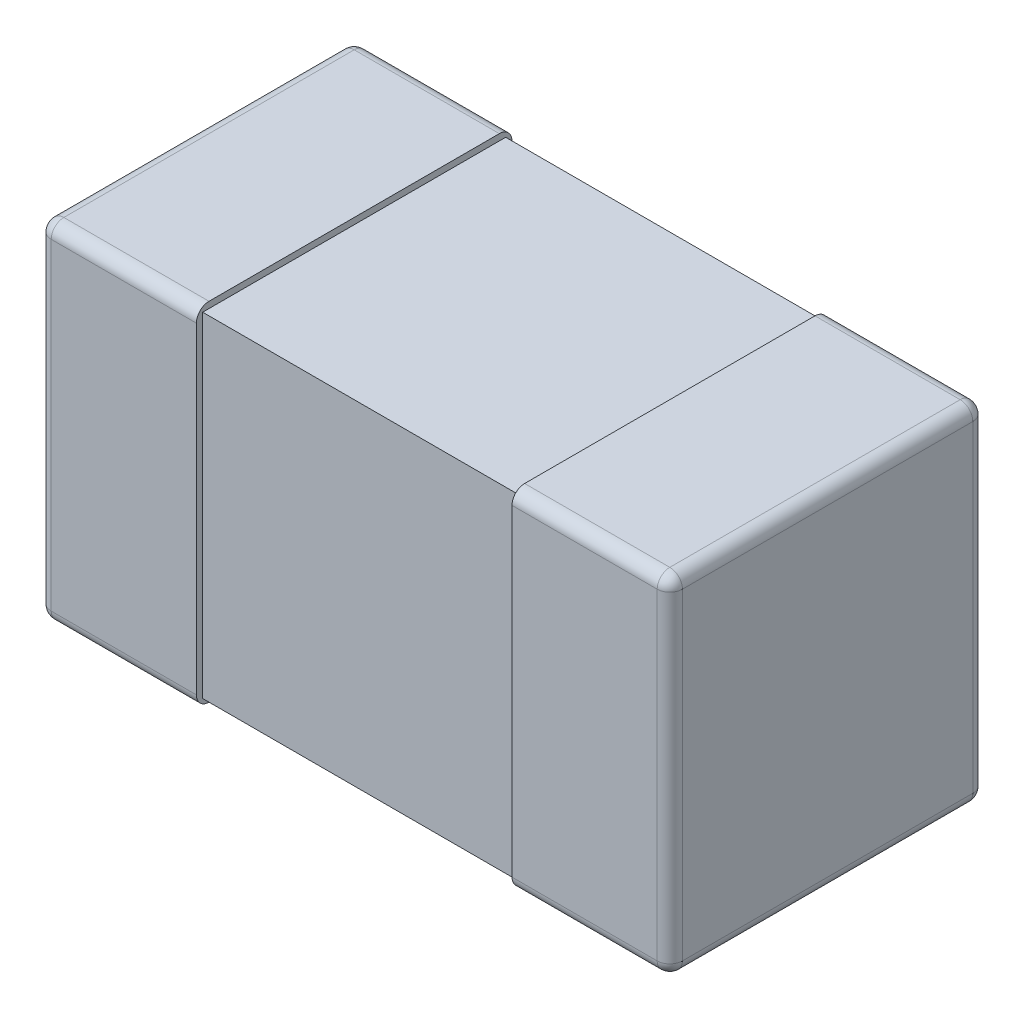
ISO-10303-21;
HEADER;
FILE_DESCRIPTION(('STEP AP214'),'2;1');
FILE_NAME('part.step','',(''),(''),'','','');
FILE_SCHEMA(('AUTOMOTIVE_DESIGN { 1 0 10303 214 1 1 1 1 }'));
ENDSEC;
DATA;
#1=APPLICATION_CONTEXT('core data for automotive mechanical design processes');
#2=APPLICATION_PROTOCOL_DEFINITION('international standard','automotive_design',2000,#1);
#3=PRODUCT_CONTEXT('',#1,'mechanical');
#4=PRODUCT('Part','Part','',(#3));
#5=PRODUCT_RELATED_PRODUCT_CATEGORY('part','',(#4));
#6=PRODUCT_DEFINITION_FORMATION('','',#4);
#7=PRODUCT_DEFINITION_CONTEXT('part definition',#1,'design');
#8=PRODUCT_DEFINITION('design','',#6,#7);
#9=PRODUCT_DEFINITION_SHAPE('','',#8);
#10=(LENGTH_UNIT() NAMED_UNIT(*) SI_UNIT(.MILLI.,.METRE.));
#11=(NAMED_UNIT(*) PLANE_ANGLE_UNIT() SI_UNIT($,.RADIAN.));
#12=(NAMED_UNIT(*) SI_UNIT($,.STERADIAN.) SOLID_ANGLE_UNIT());
#13=UNCERTAINTY_MEASURE_WITH_UNIT(LENGTH_MEASURE(1.E-05),#10,'distance_accuracy_value','');
#14=(GEOMETRIC_REPRESENTATION_CONTEXT(3) GLOBAL_UNCERTAINTY_ASSIGNED_CONTEXT((#13)) GLOBAL_UNIT_ASSIGNED_CONTEXT((#10,
#11,#12)) REPRESENTATION_CONTEXT('',''));
#15=CARTESIAN_POINT('',(0.,0.,0.));
#16=DIRECTION('',(0.,0.,1.));
#17=DIRECTION('',(1.,0.,0.));
#18=AXIS2_PLACEMENT_3D('',#15,#16,#17);
#19=CARTESIAN_POINT('',(0.5,0.55,0.25));
#20=DIRECTION('',(-1.,0.,0.));
#21=DIRECTION('',(0.,0.,1.));
#22=AXIS2_PLACEMENT_3D('',#19,#20,#21);
#23=PLANE('',#22);
#24=DIRECTION('',(0.,1.,0.));
#25=VECTOR('',#24,1.);
#26=CARTESIAN_POINT('',(0.5,0.55,-0.23));
#27=LINE('',#26,#25);
#28=CARTESIAN_POINT('',(0.5,0.53,-0.23));
#29=VERTEX_POINT('',#28);
#30=CARTESIAN_POINT('',(0.5,0.02,-0.23));
#31=VERTEX_POINT('',#30);
#32=EDGE_CURVE('E690',#29,#31,#27,.F.);
#33=ORIENTED_EDGE('',*,*,#32,.F.);
#34=DIRECTION('',(0.,0.,1.));
#35=VECTOR('',#34,1.);
#36=CARTESIAN_POINT('',(0.5,0.53,0.));
#37=LINE('',#36,#35);
#38=CARTESIAN_POINT('',(0.5,0.53,0.23));
#39=VERTEX_POINT('',#38);
#40=EDGE_CURVE('E415',#39,#29,#37,.F.);
#41=ORIENTED_EDGE('',*,*,#40,.F.);
#42=DIRECTION('',(0.,-1.,0.));
#43=VECTOR('',#42,1.);
#44=CARTESIAN_POINT('',(0.5,0.55,0.23));
#45=LINE('',#44,#43);
#46=CARTESIAN_POINT('',(0.5,0.02,0.23));
#47=VERTEX_POINT('',#46);
#48=EDGE_CURVE('E698',#47,#39,#45,.F.);
#49=ORIENTED_EDGE('',*,*,#48,.F.);
#50=DIRECTION('',(0.,0.,-1.));
#51=VECTOR('',#50,1.);
#52=CARTESIAN_POINT('',(0.5,0.02,0.25));
#53=LINE('',#52,#51);
#54=EDGE_CURVE('E465',#31,#47,#53,.F.);
#55=ORIENTED_EDGE('',*,*,#54,.F.);
#56=EDGE_LOOP('',(#33,#41,#49,#55));
#57=FACE_BOUND('',#56,.T.);
#58=ADVANCED_FACE('F17',(#57),#23,.F.);
#59=CARTESIAN_POINT('',(-0.5,0.55,0.));
#60=DIRECTION('',(-1.,0.,0.));
#61=DIRECTION('',(0.,0.,1.));
#62=AXIS2_PLACEMENT_3D('',#59,#60,#61);
#63=PLANE('',#62);
#64=DIRECTION('',(0.,0.,-1.));
#65=VECTOR('',#64,1.);
#66=CARTESIAN_POINT('',(-0.5,0.53,0.));
#67=LINE('',#66,#65);
#68=CARTESIAN_POINT('',(-0.5,0.53,-0.23));
#69=VERTEX_POINT('',#68);
#70=CARTESIAN_POINT('',(-0.5,0.53,0.23));
#71=VERTEX_POINT('',#70);
#72=EDGE_CURVE('E409',#69,#71,#67,.F.);
#73=ORIENTED_EDGE('',*,*,#72,.F.);
#74=DIRECTION('',(0.,1.,0.));
#75=VECTOR('',#74,1.);
#76=CARTESIAN_POINT('',(-0.5,0.55,-0.23));
#77=LINE('',#76,#75);
#78=CARTESIAN_POINT('',(-0.5,0.02,-0.23));
#79=VERTEX_POINT('',#78);
#80=EDGE_CURVE('E357',#79,#69,#77,.T.);
#81=ORIENTED_EDGE('',*,*,#80,.F.);
#82=DIRECTION('',(0.,0.,1.));
#83=VECTOR('',#82,1.);
#84=CARTESIAN_POINT('',(-0.5,0.02,0.));
#85=LINE('',#84,#83);
#86=CARTESIAN_POINT('',(-0.5,0.02,0.23));
#87=VERTEX_POINT('',#86);
#88=EDGE_CURVE('E672',#87,#79,#85,.F.);
#89=ORIENTED_EDGE('',*,*,#88,.F.);
#90=DIRECTION('',(0.,-1.,0.));
#91=VECTOR('',#90,1.);
#92=CARTESIAN_POINT('',(-0.5,0.55,0.23));
#93=LINE('',#92,#91);
#94=EDGE_CURVE('E314',#71,#87,#93,.T.);
#95=ORIENTED_EDGE('',*,*,#94,.F.);
#96=EDGE_LOOP('',(#73,#81,#89,#95));
#97=FACE_BOUND('',#96,.T.);
#98=ADVANCED_FACE('F490',(#97),#63,.T.);
#99=CARTESIAN_POINT('',(0.48,0.55,-0.23));
#100=DIRECTION('',(0.,1.,0.));
#101=DIRECTION('',(0.,0.,1.));
#102=AXIS2_PLACEMENT_3D('',#99,#100,#101);
#103=CYLINDRICAL_SURFACE('',#102,0.02);
#104=CARTESIAN_POINT('',(0.48,0.02,-0.23));
#105=DIRECTION('',(0.,1.,0.));
#106=DIRECTION('',(1.,0.,0.));
#107=AXIS2_PLACEMENT_3D('',#104,#105,#106);
#108=CIRCLE('',#107,0.02);
#109=CARTESIAN_POINT('',(0.48,0.02,-0.25));
#110=VERTEX_POINT('',#109);
#111=EDGE_CURVE('E478',#110,#31,#108,.F.);
#112=ORIENTED_EDGE('',*,*,#111,.F.);
#113=DIRECTION('',(0.,1.,0.));
#114=VECTOR('',#113,1.);
#115=CARTESIAN_POINT('',(0.48,0.55,-0.25));
#116=LINE('',#115,#114);
#117=CARTESIAN_POINT('',(0.48,0.53,-0.25));
#118=VERTEX_POINT('',#117);
#119=EDGE_CURVE('E296',#118,#110,#116,.F.);
#120=ORIENTED_EDGE('',*,*,#119,.F.);
#121=CARTESIAN_POINT('',(0.48,0.53,-0.23));
#122=DIRECTION('',(0.,1.,0.));
#123=DIRECTION('',(1.,0.,0.));
#124=AXIS2_PLACEMENT_3D('',#121,#122,#123);
#125=CIRCLE('',#124,0.02);
#126=EDGE_CURVE('E406',#29,#118,#125,.T.);
#127=ORIENTED_EDGE('',*,*,#126,.F.);
#128=ORIENTED_EDGE('',*,*,#32,.T.);
#129=EDGE_LOOP('',(#112,#120,#127,#128));
#130=FACE_BOUND('',#129,.T.);
#131=ADVANCED_FACE('F487',(#130),#103,.T.);
#132=CARTESIAN_POINT('',(0.48,0.02,-0.23));
#133=DIRECTION('',(1.,0.,0.));
#134=DIRECTION('',(0.,0.,-1.));
#135=AXIS2_PLACEMENT_3D('',#132,#133,#134);
#136=SPHERICAL_SURFACE('',#135,0.02);
#137=CARTESIAN_POINT('',(0.48,0.02,-0.23));
#138=DIRECTION('',(0.,0.,-1.));
#139=DIRECTION('',(-1.,0.,0.));
#140=AXIS2_PLACEMENT_3D('',#137,#138,#139);
#141=CIRCLE('',#140,0.02);
#142=CARTESIAN_POINT('',(0.48,0.,-0.23));
#143=VERTEX_POINT('',#142);
#144=EDGE_CURVE('E475',#143,#31,#141,.F.);
#145=ORIENTED_EDGE('',*,*,#144,.F.);
#146=CARTESIAN_POINT('',(0.48,0.02,-0.23));
#147=DIRECTION('',(-1.,0.,0.));
#148=DIRECTION('',(0.,0.,1.));
#149=AXIS2_PLACEMENT_3D('',#146,#147,#148);
#150=CIRCLE('',#149,0.02);
#151=EDGE_CURVE('E187',#110,#143,#150,.T.);
#152=ORIENTED_EDGE('',*,*,#151,.F.);
#153=ORIENTED_EDGE('',*,*,#111,.T.);
#154=EDGE_LOOP('',(#145,#152,#153));
#155=FACE_BOUND('',#154,.T.);
#156=ADVANCED_FACE('F484',(#155),#136,.T.);
#157=CARTESIAN_POINT('',(0.48,0.02,0.25));
#158=DIRECTION('',(0.,0.,-1.));
#159=DIRECTION('',(-1.,0.,0.));
#160=AXIS2_PLACEMENT_3D('',#157,#158,#159);
#161=CYLINDRICAL_SURFACE('',#160,0.02);
#162=ORIENTED_EDGE('',*,*,#144,.T.);
#163=ORIENTED_EDGE('',*,*,#54,.T.);
#164=CARTESIAN_POINT('',(0.48,0.02,0.23));
#165=DIRECTION('',(0.,0.,-1.));
#166=DIRECTION('',(1.,0.,0.));
#167=AXIS2_PLACEMENT_3D('',#164,#165,#166);
#168=CIRCLE('',#167,0.02);
#169=CARTESIAN_POINT('',(0.48,0.,0.23));
#170=VERTEX_POINT('',#169);
#171=EDGE_CURVE('E461',#170,#47,#168,.F.);
#172=ORIENTED_EDGE('',*,*,#171,.F.);
#173=DIRECTION('',(0.,0.,1.));
#174=VECTOR('',#173,1.);
#175=CARTESIAN_POINT('',(0.48,0.,0.));
#176=LINE('',#175,#174);
#177=EDGE_CURVE('E191',#170,#143,#176,.F.);
#178=ORIENTED_EDGE('',*,*,#177,.T.);
#179=EDGE_LOOP('',(#162,#163,#172,#178));
#180=FACE_BOUND('',#179,.T.);
#181=ADVANCED_FACE('F453',(#180),#161,.T.);
#182=CARTESIAN_POINT('',(0.48,0.02,0.23));
#183=DIRECTION('',(1.,0.,0.));
#184=DIRECTION('',(0.,0.,-1.));
#185=AXIS2_PLACEMENT_3D('',#182,#183,#184);
#186=SPHERICAL_SURFACE('',#185,0.02);
#187=CARTESIAN_POINT('',(0.48,0.02,0.23));
#188=DIRECTION('',(1.,0.,0.));
#189=DIRECTION('',(0.,0.,-1.));
#190=AXIS2_PLACEMENT_3D('',#187,#188,#189);
#191=CIRCLE('',#190,0.02);
#192=CARTESIAN_POINT('',(0.48,0.0200000000000001,0.25));
#193=VERTEX_POINT('',#192);
#194=EDGE_CURVE('E290',#170,#193,#191,.F.);
#195=ORIENTED_EDGE('',*,*,#194,.F.);
#196=ORIENTED_EDGE('',*,*,#171,.T.);
#197=CARTESIAN_POINT('',(0.48,0.0200000000000001,0.23));
#198=DIRECTION('',(0.,-1.,0.));
#199=DIRECTION('',(0.,0.,-1.));
#200=AXIS2_PLACEMENT_3D('',#197,#198,#199);
#201=CIRCLE('',#200,0.02);
#202=EDGE_CURVE('E464',#193,#47,#201,.F.);
#203=ORIENTED_EDGE('',*,*,#202,.F.);
#204=EDGE_LOOP('',(#195,#196,#203));
#205=FACE_BOUND('',#204,.T.);
#206=ADVANCED_FACE('F448',(#205),#186,.T.);
#207=CARTESIAN_POINT('',(0.48,0.55,0.23));
#208=DIRECTION('',(0.,-1.,0.));
#209=DIRECTION('',(0.,0.,-1.));
#210=AXIS2_PLACEMENT_3D('',#207,#208,#209);
#211=CYLINDRICAL_SURFACE('',#210,0.02);
#212=ORIENTED_EDGE('',*,*,#202,.T.);
#213=ORIENTED_EDGE('',*,*,#48,.T.);
#214=CARTESIAN_POINT('',(0.48,0.53,0.23));
#215=DIRECTION('',(0.,-1.,0.));
#216=DIRECTION('',(1.,0.,0.));
#217=AXIS2_PLACEMENT_3D('',#214,#215,#216);
#218=CIRCLE('',#217,0.02);
#219=CARTESIAN_POINT('',(0.48,0.53,0.25));
#220=VERTEX_POINT('',#219);
#221=EDGE_CURVE('E429',#220,#39,#218,.F.);
#222=ORIENTED_EDGE('',*,*,#221,.F.);
#223=DIRECTION('',(0.,1.,0.));
#224=VECTOR('',#223,1.);
#225=CARTESIAN_POINT('',(0.48,0.55,0.25));
#226=LINE('',#225,#224);
#227=EDGE_CURVE('E286',#220,#193,#226,.F.);
#228=ORIENTED_EDGE('',*,*,#227,.T.);
#229=EDGE_LOOP('',(#212,#213,#222,#228));
#230=FACE_BOUND('',#229,.T.);
#231=ADVANCED_FACE('F444',(#230),#211,.T.);
#232=CARTESIAN_POINT('',(0.48,0.53,0.23));
#233=DIRECTION('',(1.,0.,0.));
#234=DIRECTION('',(0.,0.,-1.));
#235=AXIS2_PLACEMENT_3D('',#232,#233,#234);
#236=SPHERICAL_SURFACE('',#235,0.02);
#237=CARTESIAN_POINT('',(0.48,0.53,0.23));
#238=DIRECTION('',(-1.,0.,0.));
#239=DIRECTION('',(0.,0.,1.));
#240=AXIS2_PLACEMENT_3D('',#237,#238,#239);
#241=CIRCLE('',#240,0.02);
#242=CARTESIAN_POINT('',(0.48,0.55,0.23));
#243=VERTEX_POINT('',#242);
#244=EDGE_CURVE('E281',#220,#243,#241,.T.);
#245=ORIENTED_EDGE('',*,*,#244,.F.);
#246=ORIENTED_EDGE('',*,*,#221,.T.);
#247=CARTESIAN_POINT('',(0.48,0.53,0.23));
#248=DIRECTION('',(0.,0.,1.));
#249=DIRECTION('',(1.,0.,0.));
#250=AXIS2_PLACEMENT_3D('',#247,#248,#249);
#251=CIRCLE('',#250,0.02);
#252=EDGE_CURVE('E426',#243,#39,#251,.F.);
#253=ORIENTED_EDGE('',*,*,#252,.F.);
#254=EDGE_LOOP('',(#245,#246,#253));
#255=FACE_BOUND('',#254,.T.);
#256=ADVANCED_FACE('F440',(#255),#236,.T.);
#257=CARTESIAN_POINT('',(0.48,0.53,0.));
#258=DIRECTION('',(0.,0.,1.));
#259=DIRECTION('',(1.,0.,0.));
#260=AXIS2_PLACEMENT_3D('',#257,#258,#259);
#261=CYLINDRICAL_SURFACE('',#260,0.02);
#262=CARTESIAN_POINT('',(0.48,0.53,-0.23));
#263=DIRECTION('',(0.,0.,1.));
#264=DIRECTION('',(1.,0.,0.));
#265=AXIS2_PLACEMENT_3D('',#262,#263,#264);
#266=CIRCLE('',#265,0.02);
#267=CARTESIAN_POINT('',(0.48,0.55,-0.23));
#268=VERTEX_POINT('',#267);
#269=EDGE_CURVE('E410',#268,#29,#266,.F.);
#270=ORIENTED_EDGE('',*,*,#269,.F.);
#271=DIRECTION('',(0.,0.,1.));
#272=VECTOR('',#271,1.);
#273=CARTESIAN_POINT('',(0.48,0.55,0.));
#274=LINE('',#273,#272);
#275=EDGE_CURVE('E275',#243,#268,#274,.F.);
#276=ORIENTED_EDGE('',*,*,#275,.F.);
#277=ORIENTED_EDGE('',*,*,#252,.T.);
#278=ORIENTED_EDGE('',*,*,#40,.T.);
#279=EDGE_LOOP('',(#270,#276,#277,#278));
#280=FACE_BOUND('',#279,.T.);
#281=ADVANCED_FACE('F443',(#280),#261,.T.);
#282=CARTESIAN_POINT('',(0.48,0.53,-0.23));
#283=DIRECTION('',(1.,0.,0.));
#284=DIRECTION('',(0.,0.,-1.));
#285=AXIS2_PLACEMENT_3D('',#282,#283,#284);
#286=SPHERICAL_SURFACE('',#285,0.02);
#287=ORIENTED_EDGE('',*,*,#269,.T.);
#288=ORIENTED_EDGE('',*,*,#126,.T.);
#289=CARTESIAN_POINT('',(0.48,0.53,-0.23));
#290=DIRECTION('',(1.,0.,0.));
#291=DIRECTION('',(0.,0.,-1.));
#292=AXIS2_PLACEMENT_3D('',#289,#290,#291);
#293=CIRCLE('',#292,0.02);
#294=EDGE_CURVE('E264',#268,#118,#293,.F.);
#295=ORIENTED_EDGE('',*,*,#294,.F.);
#296=EDGE_LOOP('',(#287,#288,#295));
#297=FACE_BOUND('',#296,.T.);
#298=ADVANCED_FACE('F389',(#297),#286,.T.);
#299=CARTESIAN_POINT('',(-0.48,0.53,0.23));
#300=DIRECTION('',(1.,0.,0.));
#301=DIRECTION('',(0.,0.,-1.));
#302=AXIS2_PLACEMENT_3D('',#299,#300,#301);
#303=SPHERICAL_SURFACE('',#302,0.02);
#304=CARTESIAN_POINT('',(-0.48,0.53,0.23));
#305=DIRECTION('',(0.,0.,-1.));
#306=DIRECTION('',(-1.,0.,0.));
#307=AXIS2_PLACEMENT_3D('',#304,#305,#306);
#308=CIRCLE('',#307,0.02);
#309=CARTESIAN_POINT('',(-0.48,0.55,0.23));
#310=VERTEX_POINT('',#309);
#311=EDGE_CURVE('E687',#71,#310,#308,.T.);
#312=ORIENTED_EDGE('',*,*,#311,.F.);
#313=CARTESIAN_POINT('',(-0.48,0.53,0.23));
#314=DIRECTION('',(0.,-1.,0.));
#315=DIRECTION('',(0.,0.,-1.));
#316=AXIS2_PLACEMENT_3D('',#313,#314,#315);
#317=CIRCLE('',#316,0.02);
#318=CARTESIAN_POINT('',(-0.48,0.53,0.25));
#319=VERTEX_POINT('',#318);
#320=EDGE_CURVE('E311',#319,#71,#317,.T.);
#321=ORIENTED_EDGE('',*,*,#320,.F.);
#322=CARTESIAN_POINT('',(-0.48,0.53,0.23));
#323=DIRECTION('',(-1.,0.,0.));
#324=DIRECTION('',(0.,0.,1.));
#325=AXIS2_PLACEMENT_3D('',#322,#323,#324);
#326=CIRCLE('',#325,0.02);
#327=EDGE_CURVE('E263',#310,#319,#326,.F.);
#328=ORIENTED_EDGE('',*,*,#327,.F.);
#329=EDGE_LOOP('',(#312,#321,#328));
#330=FACE_BOUND('',#329,.T.);
#331=ADVANCED_FACE('F384',(#330),#303,.T.);
#332=CARTESIAN_POINT('',(-0.48,0.53,0.));
#333=DIRECTION('',(0.,0.,-1.));
#334=DIRECTION('',(-1.,0.,0.));
#335=AXIS2_PLACEMENT_3D('',#332,#333,#334);
#336=CYLINDRICAL_SURFACE('',#335,0.02);
#337=ORIENTED_EDGE('',*,*,#311,.T.);
#338=DIRECTION('',(0.,0.,1.));
#339=VECTOR('',#338,1.);
#340=CARTESIAN_POINT('',(-0.48,0.55,0.));
#341=LINE('',#340,#339);
#342=CARTESIAN_POINT('',(-0.48,0.55,-0.23));
#343=VERTEX_POINT('',#342);
#344=EDGE_CURVE('E257',#343,#310,#341,.T.);
#345=ORIENTED_EDGE('',*,*,#344,.F.);
#346=CARTESIAN_POINT('',(-0.48,0.53,-0.23));
#347=DIRECTION('',(0.,0.,1.));
#348=DIRECTION('',(1.,0.,0.));
#349=AXIS2_PLACEMENT_3D('',#346,#347,#348);
#350=CIRCLE('',#349,0.02);
#351=EDGE_CURVE('E363',#69,#343,#350,.F.);
#352=ORIENTED_EDGE('',*,*,#351,.F.);
#353=ORIENTED_EDGE('',*,*,#72,.T.);
#354=EDGE_LOOP('',(#337,#345,#352,#353));
#355=FACE_BOUND('',#354,.T.);
#356=ADVANCED_FACE('F380',(#355),#336,.T.);
#357=CARTESIAN_POINT('',(-0.48,0.53,-0.23));
#358=DIRECTION('',(1.,0.,0.));
#359=DIRECTION('',(0.,0.,-1.));
#360=AXIS2_PLACEMENT_3D('',#357,#358,#359);
#361=SPHERICAL_SURFACE('',#360,0.02);
#362=CARTESIAN_POINT('',(-0.48,0.53,-0.23));
#363=DIRECTION('',(0.,1.,0.));
#364=DIRECTION('',(0.,0.,1.));
#365=AXIS2_PLACEMENT_3D('',#362,#363,#364);
#366=CIRCLE('',#365,0.02);
#367=CARTESIAN_POINT('',(-0.48,0.53,-0.25));
#368=VERTEX_POINT('',#367);
#369=EDGE_CURVE('E360',#69,#368,#366,.F.);
#370=ORIENTED_EDGE('',*,*,#369,.F.);
#371=ORIENTED_EDGE('',*,*,#351,.T.);
#372=CARTESIAN_POINT('',(-0.48,0.53,-0.23));
#373=DIRECTION('',(1.,0.,0.));
#374=DIRECTION('',(0.,0.,-1.));
#375=AXIS2_PLACEMENT_3D('',#372,#373,#374);
#376=CIRCLE('',#375,0.02);
#377=EDGE_CURVE('E251',#368,#343,#376,.T.);
#378=ORIENTED_EDGE('',*,*,#377,.F.);
#379=EDGE_LOOP('',(#370,#371,#378));
#380=FACE_BOUND('',#379,.T.);
#381=ADVANCED_FACE('F377',(#380),#361,.T.);
#382=CARTESIAN_POINT('',(-0.48,0.55,-0.23));
#383=DIRECTION('',(0.,1.,0.));
#384=DIRECTION('',(0.,0.,1.));
#385=AXIS2_PLACEMENT_3D('',#382,#383,#384);
#386=CYLINDRICAL_SURFACE('',#385,0.02);
#387=CARTESIAN_POINT('',(-0.48,0.02,-0.23));
#388=DIRECTION('',(0.,1.,0.));
#389=DIRECTION('',(1.,0.,0.));
#390=AXIS2_PLACEMENT_3D('',#387,#388,#389);
#391=CIRCLE('',#390,0.02);
#392=CARTESIAN_POINT('',(-0.48,0.02,-0.25));
#393=VERTEX_POINT('',#392);
#394=EDGE_CURVE('E353',#79,#393,#391,.F.);
#395=ORIENTED_EDGE('',*,*,#394,.F.);
#396=ORIENTED_EDGE('',*,*,#80,.T.);
#397=ORIENTED_EDGE('',*,*,#369,.T.);
#398=DIRECTION('',(0.,1.,0.));
#399=VECTOR('',#398,1.);
#400=CARTESIAN_POINT('',(-0.48,0.55,-0.25));
#401=LINE('',#400,#399);
#402=EDGE_CURVE('E245',#368,#393,#401,.F.);
#403=ORIENTED_EDGE('',*,*,#402,.T.);
#404=EDGE_LOOP('',(#395,#396,#397,#403));
#405=FACE_BOUND('',#404,.T.);
#406=ADVANCED_FACE('F345',(#405),#386,.T.);
#407=CARTESIAN_POINT('',(-0.48,0.02,-0.23));
#408=DIRECTION('',(1.,0.,0.));
#409=DIRECTION('',(0.,0.,-1.));
#410=AXIS2_PLACEMENT_3D('',#407,#408,#409);
#411=SPHERICAL_SURFACE('',#410,0.02);
#412=CARTESIAN_POINT('',(-0.48,0.02,-0.23));
#413=DIRECTION('',(-1.,0.,0.));
#414=DIRECTION('',(0.,0.,1.));
#415=AXIS2_PLACEMENT_3D('',#412,#413,#414);
#416=CIRCLE('',#415,0.02);
#417=CARTESIAN_POINT('',(-0.48,0.,-0.23));
#418=VERTEX_POINT('',#417);
#419=EDGE_CURVE('E239',#418,#393,#416,.F.);
#420=ORIENTED_EDGE('',*,*,#419,.F.);
#421=CARTESIAN_POINT('',(-0.48,0.02,-0.23));
#422=DIRECTION('',(0.,0.,1.));
#423=DIRECTION('',(1.,0.,0.));
#424=AXIS2_PLACEMENT_3D('',#421,#422,#423);
#425=CIRCLE('',#424,0.02);
#426=EDGE_CURVE('E356',#79,#418,#425,.T.);
#427=ORIENTED_EDGE('',*,*,#426,.F.);
#428=ORIENTED_EDGE('',*,*,#394,.T.);
#429=EDGE_LOOP('',(#420,#427,#428));
#430=FACE_BOUND('',#429,.T.);
#431=ADVANCED_FACE('F340',(#430),#411,.T.);
#432=CARTESIAN_POINT('',(-0.48,0.02,0.));
#433=DIRECTION('',(0.,0.,1.));
#434=DIRECTION('',(1.,0.,0.));
#435=AXIS2_PLACEMENT_3D('',#432,#433,#434);
#436=CYLINDRICAL_SURFACE('',#435,0.02);
#437=CARTESIAN_POINT('',(-0.48,0.02,0.23));
#438=DIRECTION('',(0.,0.,-1.));
#439=DIRECTION('',(1.,0.,0.));
#440=AXIS2_PLACEMENT_3D('',#437,#438,#439);
#441=CIRCLE('',#440,0.02);
#442=CARTESIAN_POINT('',(-0.48,0.,0.23));
#443=VERTEX_POINT('',#442);
#444=EDGE_CURVE('E315',#87,#443,#441,.F.);
#445=ORIENTED_EDGE('',*,*,#444,.F.);
#446=ORIENTED_EDGE('',*,*,#88,.T.);
#447=ORIENTED_EDGE('',*,*,#426,.T.);
#448=DIRECTION('',(0.,0.,1.));
#449=VECTOR('',#448,1.);
#450=CARTESIAN_POINT('',(-0.48,0.,0.));
#451=LINE('',#450,#449);
#452=EDGE_CURVE('E233',#418,#443,#451,.T.);
#453=ORIENTED_EDGE('',*,*,#452,.T.);
#454=EDGE_LOOP('',(#445,#446,#447,#453));
#455=FACE_BOUND('',#454,.T.);
#456=ADVANCED_FACE('F335',(#455),#436,.T.);
#457=CARTESIAN_POINT('',(-0.48,0.02,0.23));
#458=DIRECTION('',(1.,0.,0.));
#459=DIRECTION('',(0.,0.,-1.));
#460=AXIS2_PLACEMENT_3D('',#457,#458,#459);
#461=SPHERICAL_SURFACE('',#460,0.02);
#462=CARTESIAN_POINT('',(-0.48,0.02,0.23));
#463=DIRECTION('',(1.,0.,0.));
#464=DIRECTION('',(0.,0.,-1.));
#465=AXIS2_PLACEMENT_3D('',#462,#463,#464);
#466=CIRCLE('',#465,0.02);
#467=CARTESIAN_POINT('',(-0.48,0.0200000000000001,0.25));
#468=VERTEX_POINT('',#467);
#469=EDGE_CURVE('E227',#468,#443,#466,.T.);
#470=ORIENTED_EDGE('',*,*,#469,.F.);
#471=CARTESIAN_POINT('',(-0.48,0.0200000000000001,0.23));
#472=DIRECTION('',(0.,-1.,0.));
#473=DIRECTION('',(0.,0.,-1.));
#474=AXIS2_PLACEMENT_3D('',#471,#472,#473);
#475=CIRCLE('',#474,0.02);
#476=EDGE_CURVE('E318',#87,#468,#475,.F.);
#477=ORIENTED_EDGE('',*,*,#476,.F.);
#478=ORIENTED_EDGE('',*,*,#444,.T.);
#479=EDGE_LOOP('',(#470,#477,#478));
#480=FACE_BOUND('',#479,.T.);
#481=ADVANCED_FACE('F330',(#480),#461,.T.);
#482=CARTESIAN_POINT('',(-0.48,0.55,0.23));
#483=DIRECTION('',(0.,-1.,0.));
#484=DIRECTION('',(0.,0.,-1.));
#485=AXIS2_PLACEMENT_3D('',#482,#483,#484);
#486=CYLINDRICAL_SURFACE('',#485,0.02);
#487=ORIENTED_EDGE('',*,*,#476,.T.);
#488=DIRECTION('',(0.,1.,0.));
#489=VECTOR('',#488,1.);
#490=CARTESIAN_POINT('',(-0.48,0.55,0.25));
#491=LINE('',#490,#489);
#492=EDGE_CURVE('E217',#319,#468,#491,.F.);
#493=ORIENTED_EDGE('',*,*,#492,.F.);
#494=ORIENTED_EDGE('',*,*,#320,.T.);
#495=ORIENTED_EDGE('',*,*,#94,.T.);
#496=EDGE_LOOP('',(#487,#493,#494,#495));
#497=FACE_BOUND('',#496,.T.);
#498=ADVANCED_FACE('F334',(#497),#486,.T.);
#499=CARTESIAN_POINT('',(0.25,0.55,-0.25));
#500=DIRECTION('',(0.,0.,-1.));
#501=DIRECTION('',(-1.,0.,0.));
#502=AXIS2_PLACEMENT_3D('',#499,#500,#501);
#503=PLANE('',#502);
#504=DIRECTION('',(0.,1.,0.));
#505=VECTOR('',#504,1.);
#506=CARTESIAN_POINT('',(0.25,0.55,-0.25));
#507=LINE('',#506,#505);
#508=CARTESIAN_POINT('',(0.25,0.53,-0.25));
#509=VERTEX_POINT('',#508);
#510=CARTESIAN_POINT('',(0.25,0.02,-0.25));
#511=VERTEX_POINT('',#510);
#512=EDGE_CURVE('E206',#509,#511,#507,.F.);
#513=ORIENTED_EDGE('',*,*,#512,.F.);
#514=DIRECTION('',(1.,0.,0.));
#515=VECTOR('',#514,1.);
#516=CARTESIAN_POINT('',(0.25,0.53,-0.25));
#517=LINE('',#516,#515);
#518=EDGE_CURVE('E260',#118,#509,#517,.F.);
#519=ORIENTED_EDGE('',*,*,#518,.F.);
#520=ORIENTED_EDGE('',*,*,#119,.T.);
#521=DIRECTION('',(-1.,0.,0.));
#522=VECTOR('',#521,1.);
#523=CARTESIAN_POINT('',(0.,0.02,-0.25));
#524=LINE('',#523,#522);
#525=EDGE_CURVE('E175',#511,#110,#524,.F.);
#526=ORIENTED_EDGE('',*,*,#525,.F.);
#527=EDGE_LOOP('',(#513,#519,#520,#526));
#528=FACE_BOUND('',#527,.T.);
#529=ADVANCED_FACE('F580',(#528),#503,.T.);
#530=CARTESIAN_POINT('',(0.,0.02,-0.23));
#531=DIRECTION('',(-1.,0.,0.));
#532=DIRECTION('',(0.,0.,1.));
#533=AXIS2_PLACEMENT_3D('',#530,#531,#532);
#534=CYLINDRICAL_SURFACE('',#533,0.02);
#535=ORIENTED_EDGE('',*,*,#151,.T.);
#536=DIRECTION('',(1.,0.,0.));
#537=VECTOR('',#536,1.);
#538=CARTESIAN_POINT('',(0.,0.,-0.23));
#539=LINE('',#538,#537);
#540=CARTESIAN_POINT('',(0.25,0.,-0.23));
#541=VERTEX_POINT('',#540);
#542=EDGE_CURVE('E181',#143,#541,#539,.F.);
#543=ORIENTED_EDGE('',*,*,#542,.T.);
#544=CARTESIAN_POINT('',(0.25,0.02,-0.23));
#545=DIRECTION('',(-1.,0.,0.));
#546=DIRECTION('',(0.,0.,1.));
#547=AXIS2_PLACEMENT_3D('',#544,#545,#546);
#548=CIRCLE('',#547,0.02);
#549=EDGE_CURVE('E20',#511,#541,#548,.T.);
#550=ORIENTED_EDGE('',*,*,#549,.F.);
#551=ORIENTED_EDGE('',*,*,#525,.T.);
#552=EDGE_LOOP('',(#535,#543,#550,#551));
#553=FACE_BOUND('',#552,.T.);
#554=ADVANCED_FACE('F183',(#553),#534,.T.);
#555=CARTESIAN_POINT('',(0.,0.,0.));
#556=DIRECTION('',(0.,1.,0.));
#557=DIRECTION('',(0.,0.,1.));
#558=AXIS2_PLACEMENT_3D('',#555,#556,#557);
#559=PLANE('',#558);
#560=ORIENTED_EDGE('',*,*,#542,.F.);
#561=ORIENTED_EDGE('',*,*,#177,.F.);
#562=DIRECTION('',(1.,0.,0.));
#563=VECTOR('',#562,1.);
#564=CARTESIAN_POINT('',(0.25,0.,0.23));
#565=LINE('',#564,#563);
#566=CARTESIAN_POINT('',(0.25,0.,0.23));
#567=VERTEX_POINT('',#566);
#568=EDGE_CURVE('E190',#567,#170,#565,.T.);
#569=ORIENTED_EDGE('',*,*,#568,.F.);
#570=DIRECTION('',(0.,0.,1.));
#571=VECTOR('',#570,1.);
#572=CARTESIAN_POINT('',(0.25,0.,0.25));
#573=LINE('',#572,#571);
#574=EDGE_CURVE('E194',#541,#567,#573,.T.);
#575=ORIENTED_EDGE('',*,*,#574,.F.);
#576=EDGE_LOOP('',(#560,#561,#569,#575));
#577=FACE_BOUND('',#576,.T.);
#578=ADVANCED_FACE('F195',(#577),#559,.F.);
#579=CARTESIAN_POINT('',(0.25,0.02,0.23));
#580=DIRECTION('',(1.,0.,0.));
#581=DIRECTION('',(0.,0.,-1.));
#582=AXIS2_PLACEMENT_3D('',#579,#580,#581);
#583=CYLINDRICAL_SURFACE('',#582,0.02);
#584=ORIENTED_EDGE('',*,*,#194,.T.);
#585=DIRECTION('',(-1.,0.,0.));
#586=VECTOR('',#585,1.);
#587=CARTESIAN_POINT('',(0.25,0.0200000000000001,0.25));
#588=LINE('',#587,#586);
#589=CARTESIAN_POINT('',(0.25,0.02,0.25));
#590=VERTEX_POINT('',#589);
#591=EDGE_CURVE('E284',#193,#590,#588,.T.);
#592=ORIENTED_EDGE('',*,*,#591,.T.);
#593=CARTESIAN_POINT('',(0.25,0.02,0.23));
#594=DIRECTION('',(1.,0.,0.));
#595=DIRECTION('',(0.,0.,-1.));
#596=AXIS2_PLACEMENT_3D('',#593,#594,#595);
#597=CIRCLE('',#596,0.02);
#598=EDGE_CURVE('E200',#567,#590,#597,.F.);
#599=ORIENTED_EDGE('',*,*,#598,.F.);
#600=ORIENTED_EDGE('',*,*,#568,.T.);
#601=EDGE_LOOP('',(#584,#592,#599,#600));
#602=FACE_BOUND('',#601,.T.);
#603=ADVANCED_FACE('F572',(#602),#583,.T.);
#604=CARTESIAN_POINT('',(0.25,0.55,0.25));
#605=DIRECTION('',(0.,0.,-1.));
#606=DIRECTION('',(-1.,0.,0.));
#607=AXIS2_PLACEMENT_3D('',#604,#605,#606);
#608=PLANE('',#607);
#609=ORIENTED_EDGE('',*,*,#591,.F.);
#610=ORIENTED_EDGE('',*,*,#227,.F.);
#611=DIRECTION('',(-1.,0.,0.));
#612=VECTOR('',#611,1.);
#613=CARTESIAN_POINT('',(0.,0.53,0.25));
#614=LINE('',#613,#612);
#615=CARTESIAN_POINT('',(0.25,0.53,0.25));
#616=VERTEX_POINT('',#615);
#617=EDGE_CURVE('E278',#616,#220,#614,.F.);
#618=ORIENTED_EDGE('',*,*,#617,.F.);
#619=DIRECTION('',(0.,1.,0.));
#620=VECTOR('',#619,1.);
#621=CARTESIAN_POINT('',(0.25,0.55,0.25));
#622=LINE('',#621,#620);
#623=EDGE_CURVE('E603',#590,#616,#622,.T.);
#624=ORIENTED_EDGE('',*,*,#623,.F.);
#625=EDGE_LOOP('',(#609,#610,#618,#624));
#626=FACE_BOUND('',#625,.T.);
#627=ADVANCED_FACE('F568',(#626),#608,.F.);
#628=CARTESIAN_POINT('',(0.,0.53,0.23));
#629=DIRECTION('',(-1.,0.,0.));
#630=DIRECTION('',(0.,0.,1.));
#631=AXIS2_PLACEMENT_3D('',#628,#629,#630);
#632=CYLINDRICAL_SURFACE('',#631,0.02);
#633=CARTESIAN_POINT('',(0.25,0.53,0.23));
#634=DIRECTION('',(-1.,0.,0.));
#635=DIRECTION('',(0.,0.,1.));
#636=AXIS2_PLACEMENT_3D('',#633,#634,#635);
#637=CIRCLE('',#636,0.02);
#638=CARTESIAN_POINT('',(0.25,0.55,0.23));
#639=VERTEX_POINT('',#638);
#640=EDGE_CURVE('E597',#616,#639,#637,.T.);
#641=ORIENTED_EDGE('',*,*,#640,.F.);
#642=ORIENTED_EDGE('',*,*,#617,.T.);
#643=ORIENTED_EDGE('',*,*,#244,.T.);
#644=DIRECTION('',(1.,0.,0.));
#645=VECTOR('',#644,1.);
#646=CARTESIAN_POINT('',(0.,0.55,0.23));
#647=LINE('',#646,#645);
#648=EDGE_CURVE('E270',#639,#243,#647,.T.);
#649=ORIENTED_EDGE('',*,*,#648,.F.);
#650=EDGE_LOOP('',(#641,#642,#643,#649));
#651=FACE_BOUND('',#650,.T.);
#652=ADVANCED_FACE('F564',(#651),#632,.T.);
#653=CARTESIAN_POINT('',(0.,0.55,0.));
#654=DIRECTION('',(0.,1.,0.));
#655=DIRECTION('',(0.,0.,1.));
#656=AXIS2_PLACEMENT_3D('',#653,#654,#655);
#657=PLANE('',#656);
#658=DIRECTION('',(0.,0.,1.));
#659=VECTOR('',#658,1.);
#660=CARTESIAN_POINT('',(0.25,0.55,0.25));
#661=LINE('',#660,#659);
#662=CARTESIAN_POINT('',(0.25,0.55,-0.23));
#663=VERTEX_POINT('',#662);
#664=EDGE_CURVE('E592',#639,#663,#661,.F.);
#665=ORIENTED_EDGE('',*,*,#664,.F.);
#666=ORIENTED_EDGE('',*,*,#648,.T.);
#667=ORIENTED_EDGE('',*,*,#275,.T.);
#668=DIRECTION('',(1.,0.,0.));
#669=VECTOR('',#668,1.);
#670=CARTESIAN_POINT('',(0.25,0.55,-0.23));
#671=LINE('',#670,#669);
#672=EDGE_CURVE('E267',#663,#268,#671,.T.);
#673=ORIENTED_EDGE('',*,*,#672,.F.);
#674=EDGE_LOOP('',(#665,#666,#667,#673));
#675=FACE_BOUND('',#674,.T.);
#676=ADVANCED_FACE('F560',(#675),#657,.T.);
#677=CARTESIAN_POINT('',(0.25,0.53,-0.23));
#678=DIRECTION('',(1.,0.,0.));
#679=DIRECTION('',(0.,0.,-1.));
#680=AXIS2_PLACEMENT_3D('',#677,#678,#679);
#681=CYLINDRICAL_SURFACE('',#680,0.02);
#682=ORIENTED_EDGE('',*,*,#294,.T.);
#683=ORIENTED_EDGE('',*,*,#518,.T.);
#684=CARTESIAN_POINT('',(0.25,0.53,-0.23));
#685=DIRECTION('',(1.,0.,0.));
#686=DIRECTION('',(0.,0.,-1.));
#687=AXIS2_PLACEMENT_3D('',#684,#685,#686);
#688=CIRCLE('',#687,0.02);
#689=EDGE_CURVE('E588',#663,#509,#688,.F.);
#690=ORIENTED_EDGE('',*,*,#689,.F.);
#691=ORIENTED_EDGE('',*,*,#672,.T.);
#692=EDGE_LOOP('',(#682,#683,#690,#691));
#693=FACE_BOUND('',#692,.T.);
#694=ADVANCED_FACE('F556',(#693),#681,.T.);
#695=CARTESIAN_POINT('',(0.,0.53,0.23));
#696=DIRECTION('',(-1.,0.,0.));
#697=DIRECTION('',(0.,0.,1.));
#698=AXIS2_PLACEMENT_3D('',#695,#696,#697);
#699=CYLINDRICAL_SURFACE('',#698,0.02);
#700=ORIENTED_EDGE('',*,*,#327,.T.);
#701=DIRECTION('',(1.,0.,0.));
#702=VECTOR('',#701,1.);
#703=CARTESIAN_POINT('',(0.,0.53,0.25));
#704=LINE('',#703,#702);
#705=CARTESIAN_POINT('',(-0.25,0.53,0.25));
#706=VERTEX_POINT('',#705);
#707=EDGE_CURVE('E210',#706,#319,#704,.F.);
#708=ORIENTED_EDGE('',*,*,#707,.F.);
#709=CARTESIAN_POINT('',(-0.25,0.53,0.23));
#710=DIRECTION('',(-1.,0.,0.));
#711=DIRECTION('',(0.,0.,1.));
#712=AXIS2_PLACEMENT_3D('',#709,#710,#711);
#713=CIRCLE('',#712,0.02);
#714=CARTESIAN_POINT('',(-0.25,0.55,0.23));
#715=VERTEX_POINT('',#714);
#716=EDGE_CURVE('E601',#706,#715,#713,.T.);
#717=ORIENTED_EDGE('',*,*,#716,.T.);
#718=DIRECTION('',(1.,0.,0.));
#719=VECTOR('',#718,1.);
#720=CARTESIAN_POINT('',(0.,0.55,0.23));
#721=LINE('',#720,#719);
#722=EDGE_CURVE('E254',#310,#715,#721,.T.);
#723=ORIENTED_EDGE('',*,*,#722,.F.);
#724=EDGE_LOOP('',(#700,#708,#717,#723));
#725=FACE_BOUND('',#724,.T.);
#726=ADVANCED_FACE('F552',(#725),#699,.T.);
#727=CARTESIAN_POINT('',(0.,0.55,0.));
#728=DIRECTION('',(0.,1.,0.));
#729=DIRECTION('',(0.,0.,1.));
#730=AXIS2_PLACEMENT_3D('',#727,#728,#729);
#731=PLANE('',#730);
#732=ORIENTED_EDGE('',*,*,#344,.T.);
#733=ORIENTED_EDGE('',*,*,#722,.T.);
#734=DIRECTION('',(0.,0.,1.));
#735=VECTOR('',#734,1.);
#736=CARTESIAN_POINT('',(-0.25,0.55,0.));
#737=LINE('',#736,#735);
#738=CARTESIAN_POINT('',(-0.25,0.55,-0.23));
#739=VERTEX_POINT('',#738);
#740=EDGE_CURVE('E612',#715,#739,#737,.F.);
#741=ORIENTED_EDGE('',*,*,#740,.T.);
#742=DIRECTION('',(1.,0.,0.));
#743=VECTOR('',#742,1.);
#744=CARTESIAN_POINT('',(0.,0.55,-0.23));
#745=LINE('',#744,#743);
#746=EDGE_CURVE('E246',#343,#739,#745,.T.);
#747=ORIENTED_EDGE('',*,*,#746,.F.);
#748=EDGE_LOOP('',(#732,#733,#741,#747));
#749=FACE_BOUND('',#748,.T.);
#750=ADVANCED_FACE('F548',(#749),#731,.T.);
#751=CARTESIAN_POINT('',(0.,0.53,-0.23));
#752=DIRECTION('',(1.,0.,0.));
#753=DIRECTION('',(0.,0.,-1.));
#754=AXIS2_PLACEMENT_3D('',#751,#752,#753);
#755=CYLINDRICAL_SURFACE('',#754,0.02);
#756=ORIENTED_EDGE('',*,*,#377,.T.);
#757=ORIENTED_EDGE('',*,*,#746,.T.);
#758=CARTESIAN_POINT('',(-0.25,0.53,-0.23));
#759=DIRECTION('',(1.,0.,0.));
#760=DIRECTION('',(0.,0.,-1.));
#761=AXIS2_PLACEMENT_3D('',#758,#759,#760);
#762=CIRCLE('',#761,0.02);
#763=CARTESIAN_POINT('',(-0.25,0.53,-0.25));
#764=VERTEX_POINT('',#763);
#765=EDGE_CURVE('E614',#739,#764,#762,.F.);
#766=ORIENTED_EDGE('',*,*,#765,.T.);
#767=DIRECTION('',(1.,0.,0.));
#768=VECTOR('',#767,1.);
#769=CARTESIAN_POINT('',(0.,0.53,-0.25));
#770=LINE('',#769,#768);
#771=EDGE_CURVE('E242',#764,#368,#770,.F.);
#772=ORIENTED_EDGE('',*,*,#771,.T.);
#773=EDGE_LOOP('',(#756,#757,#766,#772));
#774=FACE_BOUND('',#773,.T.);
#775=ADVANCED_FACE('F544',(#774),#755,.T.);
#776=CARTESIAN_POINT('',(0.,0.55,-0.25));
#777=DIRECTION('',(0.,0.,1.));
#778=DIRECTION('',(1.,0.,0.));
#779=AXIS2_PLACEMENT_3D('',#776,#777,#778);
#780=PLANE('',#779);
#781=DIRECTION('',(-1.,0.,0.));
#782=VECTOR('',#781,1.);
#783=CARTESIAN_POINT('',(0.,0.02,-0.25));
#784=LINE('',#783,#782);
#785=CARTESIAN_POINT('',(-0.25,0.02,-0.25));
#786=VERTEX_POINT('',#785);
#787=EDGE_CURVE('E234',#393,#786,#784,.F.);
#788=ORIENTED_EDGE('',*,*,#787,.F.);
#789=ORIENTED_EDGE('',*,*,#402,.F.);
#790=ORIENTED_EDGE('',*,*,#771,.F.);
#791=DIRECTION('',(0.,1.,0.));
#792=VECTOR('',#791,1.);
#793=CARTESIAN_POINT('',(-0.25,0.55,-0.25));
#794=LINE('',#793,#792);
#795=EDGE_CURVE('E615',#764,#786,#794,.F.);
#796=ORIENTED_EDGE('',*,*,#795,.T.);
#797=EDGE_LOOP('',(#788,#789,#790,#796));
#798=FACE_BOUND('',#797,.T.);
#799=ADVANCED_FACE('F540',(#798),#780,.F.);
#800=CARTESIAN_POINT('',(0.,0.02,-0.23));
#801=DIRECTION('',(-1.,0.,0.));
#802=DIRECTION('',(0.,0.,1.));
#803=AXIS2_PLACEMENT_3D('',#800,#801,#802);
#804=CYLINDRICAL_SURFACE('',#803,0.02);
#805=ORIENTED_EDGE('',*,*,#419,.T.);
#806=ORIENTED_EDGE('',*,*,#787,.T.);
#807=CARTESIAN_POINT('',(-0.25,0.02,-0.23));
#808=DIRECTION('',(-1.,0.,0.));
#809=DIRECTION('',(0.,0.,1.));
#810=AXIS2_PLACEMENT_3D('',#807,#808,#809);
#811=CIRCLE('',#810,0.02);
#812=CARTESIAN_POINT('',(-0.25,0.,-0.23));
#813=VERTEX_POINT('',#812);
#814=EDGE_CURVE('E617',#786,#813,#811,.T.);
#815=ORIENTED_EDGE('',*,*,#814,.T.);
#816=DIRECTION('',(1.,0.,0.));
#817=VECTOR('',#816,1.);
#818=CARTESIAN_POINT('',(0.,0.,-0.23));
#819=LINE('',#818,#817);
#820=EDGE_CURVE('E230',#813,#418,#819,.F.);
#821=ORIENTED_EDGE('',*,*,#820,.T.);
#822=EDGE_LOOP('',(#805,#806,#815,#821));
#823=FACE_BOUND('',#822,.T.);
#824=ADVANCED_FACE('F536',(#823),#804,.T.);
#825=CARTESIAN_POINT('',(0.,0.,0.));
#826=DIRECTION('',(0.,1.,0.));
#827=DIRECTION('',(0.,0.,1.));
#828=AXIS2_PLACEMENT_3D('',#825,#826,#827);
#829=PLANE('',#828);
#830=DIRECTION('',(1.,0.,0.));
#831=VECTOR('',#830,1.);
#832=CARTESIAN_POINT('',(0.,0.,0.23));
#833=LINE('',#832,#831);
#834=CARTESIAN_POINT('',(-0.25,0.,0.23));
#835=VERTEX_POINT('',#834);
#836=EDGE_CURVE('E224',#443,#835,#833,.T.);
#837=ORIENTED_EDGE('',*,*,#836,.F.);
#838=ORIENTED_EDGE('',*,*,#452,.F.);
#839=ORIENTED_EDGE('',*,*,#820,.F.);
#840=DIRECTION('',(0.,0.,1.));
#841=VECTOR('',#840,1.);
#842=CARTESIAN_POINT('',(-0.25,0.,0.));
#843=LINE('',#842,#841);
#844=EDGE_CURVE('E618',#813,#835,#843,.T.);
#845=ORIENTED_EDGE('',*,*,#844,.T.);
#846=EDGE_LOOP('',(#837,#838,#839,#845));
#847=FACE_BOUND('',#846,.T.);
#848=ADVANCED_FACE('F532',(#847),#829,.F.);
#849=CARTESIAN_POINT('',(0.,0.02,0.23));
#850=DIRECTION('',(1.,0.,0.));
#851=DIRECTION('',(0.,0.,-1.));
#852=AXIS2_PLACEMENT_3D('',#849,#850,#851);
#853=CYLINDRICAL_SURFACE('',#852,0.02);
#854=ORIENTED_EDGE('',*,*,#469,.T.);
#855=ORIENTED_EDGE('',*,*,#836,.T.);
#856=CARTESIAN_POINT('',(-0.25,0.02,0.23));
#857=DIRECTION('',(1.,0.,0.));
#858=DIRECTION('',(0.,0.,-1.));
#859=AXIS2_PLACEMENT_3D('',#856,#857,#858);
#860=CIRCLE('',#859,0.02);
#861=CARTESIAN_POINT('',(-0.25,0.02,0.25));
#862=VERTEX_POINT('',#861);
#863=EDGE_CURVE('E620',#835,#862,#860,.F.);
#864=ORIENTED_EDGE('',*,*,#863,.T.);
#865=DIRECTION('',(1.,0.,0.));
#866=VECTOR('',#865,1.);
#867=CARTESIAN_POINT('',(0.,0.0200000000000001,0.25));
#868=LINE('',#867,#866);
#869=EDGE_CURVE('E214',#468,#862,#868,.T.);
#870=ORIENTED_EDGE('',*,*,#869,.F.);
#871=EDGE_LOOP('',(#854,#855,#864,#870));
#872=FACE_BOUND('',#871,.T.);
#873=ADVANCED_FACE('F528',(#872),#853,.T.);
#874=CARTESIAN_POINT('',(0.,0.55,0.25));
#875=DIRECTION('',(0.,0.,1.));
#876=DIRECTION('',(1.,0.,0.));
#877=AXIS2_PLACEMENT_3D('',#874,#875,#876);
#878=PLANE('',#877);
#879=DIRECTION('',(0.,1.,0.));
#880=VECTOR('',#879,1.);
#881=CARTESIAN_POINT('',(-0.25,0.55,0.25));
#882=LINE('',#881,#880);
#883=EDGE_CURVE('E621',#862,#706,#882,.T.);
#884=ORIENTED_EDGE('',*,*,#883,.T.);
#885=ORIENTED_EDGE('',*,*,#707,.T.);
#886=ORIENTED_EDGE('',*,*,#492,.T.);
#887=ORIENTED_EDGE('',*,*,#869,.T.);
#888=EDGE_LOOP('',(#884,#885,#886,#887));
#889=FACE_BOUND('',#888,.T.);
#890=ADVANCED_FACE('F524',(#889),#878,.T.);
#891=CARTESIAN_POINT('',(0.,0.54,0.24));
#892=DIRECTION('',(0.,0.,-1.));
#893=DIRECTION('',(-1.,0.,0.));
#894=AXIS2_PLACEMENT_3D('',#891,#892,#893);
#895=PLANE('',#894);
#896=DIRECTION('',(0.,1.,0.));
#897=VECTOR('',#896,1.);
#898=CARTESIAN_POINT('',(0.25,0.55,0.24));
#899=LINE('',#898,#897);
#900=CARTESIAN_POINT('',(0.25,0.54,0.24));
#901=VERTEX_POINT('',#900);
#902=CARTESIAN_POINT('',(0.25,0.01,0.24));
#903=VERTEX_POINT('',#902);
#904=EDGE_CURVE('E207',#901,#903,#899,.F.);
#905=ORIENTED_EDGE('',*,*,#904,.F.);
#906=DIRECTION('',(1.,0.,0.));
#907=VECTOR('',#906,1.);
#908=CARTESIAN_POINT('',(0.,0.54,0.24));
#909=LINE('',#908,#907);
#910=CARTESIAN_POINT('',(-0.25,0.54,0.24));
#911=VERTEX_POINT('',#910);
#912=EDGE_CURVE('E628',#911,#901,#909,.T.);
#913=ORIENTED_EDGE('',*,*,#912,.F.);
#914=DIRECTION('',(0.,1.,0.));
#915=VECTOR('',#914,1.);
#916=CARTESIAN_POINT('',(-0.25,0.55,0.24));
#917=LINE('',#916,#915);
#918=CARTESIAN_POINT('',(-0.25,0.01,0.24));
#919=VERTEX_POINT('',#918);
#920=EDGE_CURVE('E608',#911,#919,#917,.F.);
#921=ORIENTED_EDGE('',*,*,#920,.T.);
#922=DIRECTION('',(1.,0.,0.));
#923=VECTOR('',#922,1.);
#924=CARTESIAN_POINT('',(0.,0.01,0.24));
#925=LINE('',#924,#923);
#926=EDGE_CURVE('E593',#919,#903,#925,.T.);
#927=ORIENTED_EDGE('',*,*,#926,.T.);
#928=EDGE_LOOP('',(#905,#913,#921,#927));
#929=FACE_BOUND('',#928,.T.);
#930=ADVANCED_FACE('F521',(#929),#895,.F.);
#931=CARTESIAN_POINT('',(0.25,0.55,0.25));
#932=DIRECTION('',(-1.,0.,0.));
#933=DIRECTION('',(0.,0.,1.));
#934=AXIS2_PLACEMENT_3D('',#931,#932,#933);
#935=PLANE('',#934);
#936=ORIENTED_EDGE('',*,*,#664,.T.);
#937=ORIENTED_EDGE('',*,*,#689,.T.);
#938=ORIENTED_EDGE('',*,*,#512,.T.);
#939=ORIENTED_EDGE('',*,*,#549,.T.);
#940=ORIENTED_EDGE('',*,*,#574,.T.);
#941=ORIENTED_EDGE('',*,*,#598,.T.);
#942=ORIENTED_EDGE('',*,*,#623,.T.);
#943=ORIENTED_EDGE('',*,*,#640,.T.);
#944=EDGE_LOOP('',(#936,#937,#938,#939,#940,#941,#942,#943));
#945=FACE_BOUND('',#944,.T.);
#946=ORIENTED_EDGE('',*,*,#904,.T.);
#947=DIRECTION('',(0.,0.,1.));
#948=VECTOR('',#947,1.);
#949=CARTESIAN_POINT('',(0.25,0.01,0.));
#950=LINE('',#949,#948);
#951=CARTESIAN_POINT('',(0.25,0.01,-0.24));
#952=VERTEX_POINT('',#951);
#953=EDGE_CURVE('E595',#903,#952,#950,.F.);
#954=ORIENTED_EDGE('',*,*,#953,.T.);
#955=DIRECTION('',(0.,1.,0.));
#956=VECTOR('',#955,1.);
#957=CARTESIAN_POINT('',(0.25,0.54,-0.24));
#958=LINE('',#957,#956);
#959=CARTESIAN_POINT('',(0.25,0.54,-0.24));
#960=VERTEX_POINT('',#959);
#961=EDGE_CURVE('E631',#960,#952,#958,.F.);
#962=ORIENTED_EDGE('',*,*,#961,.F.);
#963=DIRECTION('',(0.,0.,1.));
#964=VECTOR('',#963,1.);
#965=CARTESIAN_POINT('',(0.25,0.54,0.));
#966=LINE('',#965,#964);
#967=EDGE_CURVE('E624',#901,#960,#966,.F.);
#968=ORIENTED_EDGE('',*,*,#967,.F.);
#969=EDGE_LOOP('',(#946,#954,#962,#968));
#970=FACE_BOUND('',#969,.T.);
#971=ADVANCED_FACE('F203',(#945,#970),#935,.T.);
#972=CARTESIAN_POINT('',(0.,0.01,0.));
#973=DIRECTION('',(0.,1.,0.));
#974=DIRECTION('',(0.,0.,1.));
#975=AXIS2_PLACEMENT_3D('',#972,#973,#974);
#976=PLANE('',#975);
#977=ORIENTED_EDGE('',*,*,#953,.F.);
#978=ORIENTED_EDGE('',*,*,#926,.F.);
#979=DIRECTION('',(0.,0.,1.));
#980=VECTOR('',#979,1.);
#981=CARTESIAN_POINT('',(-0.25,0.01,0.));
#982=LINE('',#981,#980);
#983=CARTESIAN_POINT('',(-0.25,0.01,-0.24));
#984=VERTEX_POINT('',#983);
#985=EDGE_CURVE('E610',#919,#984,#982,.F.);
#986=ORIENTED_EDGE('',*,*,#985,.T.);
#987=DIRECTION('',(-1.,0.,0.));
#988=VECTOR('',#987,1.);
#989=CARTESIAN_POINT('',(0.,0.01,-0.24));
#990=LINE('',#989,#988);
#991=EDGE_CURVE('E634',#952,#984,#990,.T.);
#992=ORIENTED_EDGE('',*,*,#991,.F.);
#993=EDGE_LOOP('',(#977,#978,#986,#992));
#994=FACE_BOUND('',#993,.T.);
#995=ADVANCED_FACE('F514',(#994),#976,.F.);
#996=CARTESIAN_POINT('',(-0.25,0.55,0.));
#997=DIRECTION('',(-1.,0.,0.));
#998=DIRECTION('',(0.,0.,1.));
#999=AXIS2_PLACEMENT_3D('',#996,#997,#998);
#1000=PLANE('',#999);
#1001=ORIENTED_EDGE('',*,*,#863,.F.);
#1002=ORIENTED_EDGE('',*,*,#844,.F.);
#1003=ORIENTED_EDGE('',*,*,#814,.F.);
#1004=ORIENTED_EDGE('',*,*,#795,.F.);
#1005=ORIENTED_EDGE('',*,*,#765,.F.);
#1006=ORIENTED_EDGE('',*,*,#740,.F.);
#1007=ORIENTED_EDGE('',*,*,#716,.F.);
#1008=ORIENTED_EDGE('',*,*,#883,.F.);
#1009=EDGE_LOOP('',(#1001,#1002,#1003,#1004,#1005,#1006,#1007,#1008));
#1010=FACE_BOUND('',#1009,.T.);
#1011=DIRECTION('',(0.,1.,0.));
#1012=VECTOR('',#1011,1.);
#1013=CARTESIAN_POINT('',(-0.25,0.54,-0.24));
#1014=LINE('',#1013,#1012);
#1015=CARTESIAN_POINT('',(-0.25,0.54,-0.24));
#1016=VERTEX_POINT('',#1015);
#1017=EDGE_CURVE('E26',#984,#1016,#1014,.T.);
#1018=ORIENTED_EDGE('',*,*,#1017,.F.);
#1019=ORIENTED_EDGE('',*,*,#985,.F.);
#1020=ORIENTED_EDGE('',*,*,#920,.F.);
#1021=DIRECTION('',(0.,0.,1.));
#1022=VECTOR('',#1021,1.);
#1023=CARTESIAN_POINT('',(-0.25,0.54,0.));
#1024=LINE('',#1023,#1022);
#1025=EDGE_CURVE('E35',#1016,#911,#1024,.T.);
#1026=ORIENTED_EDGE('',*,*,#1025,.F.);
#1027=EDGE_LOOP('',(#1018,#1019,#1020,#1026));
#1028=FACE_BOUND('',#1027,.T.);
#1029=ADVANCED_FACE('F507',(#1010,#1028),#1000,.F.);
#1030=CARTESIAN_POINT('',(0.,0.54,0.));
#1031=DIRECTION('',(0.,1.,0.));
#1032=DIRECTION('',(0.,0.,1.));
#1033=AXIS2_PLACEMENT_3D('',#1030,#1031,#1032);
#1034=PLANE('',#1033);
#1035=ORIENTED_EDGE('',*,*,#1025,.T.);
#1036=ORIENTED_EDGE('',*,*,#912,.T.);
#1037=ORIENTED_EDGE('',*,*,#967,.T.);
#1038=DIRECTION('',(-1.,0.,0.));
#1039=VECTOR('',#1038,1.);
#1040=CARTESIAN_POINT('',(0.,0.54,-0.24));
#1041=LINE('',#1040,#1039);
#1042=EDGE_CURVE('E11',#1016,#960,#1041,.F.);
#1043=ORIENTED_EDGE('',*,*,#1042,.F.);
#1044=EDGE_LOOP('',(#1035,#1036,#1037,#1043));
#1045=FACE_BOUND('',#1044,.T.);
#1046=ADVANCED_FACE('F501',(#1045),#1034,.T.);
#1047=CARTESIAN_POINT('',(0.,0.54,-0.24));
#1048=DIRECTION('',(0.,0.,-1.));
#1049=DIRECTION('',(-1.,0.,0.));
#1050=AXIS2_PLACEMENT_3D('',#1047,#1048,#1049);
#1051=PLANE('',#1050);
#1052=ORIENTED_EDGE('',*,*,#1017,.T.);
#1053=ORIENTED_EDGE('',*,*,#1042,.T.);
#1054=ORIENTED_EDGE('',*,*,#961,.T.);
#1055=ORIENTED_EDGE('',*,*,#991,.T.);
#1056=EDGE_LOOP('',(#1052,#1053,#1054,#1055));
#1057=FACE_BOUND('',#1056,.T.);
#1058=ADVANCED_FACE('F499',(#1057),#1051,.T.);
#1059=CLOSED_SHELL('',(#58,#98,#131,#156,#181,#206,#231,#256,#281,#298,#331,#356,#381,#406,#431,
#456,#481,#498,#529,#554,#578,#603,#627,#652,#676,#694,#726,#750,#775,#799,#824,#848,#873,#890,
#930,#971,#995,#1029,#1046,#1058));
#1060=MANIFOLD_SOLID_BREP('B1',#1059);
#1061=ADVANCED_BREP_SHAPE_REPRESENTATION('',(#18,#1060),#14);
#1062=SHAPE_DEFINITION_REPRESENTATION(#9,#1061);
ENDSEC;
END-ISO-10303-21;
